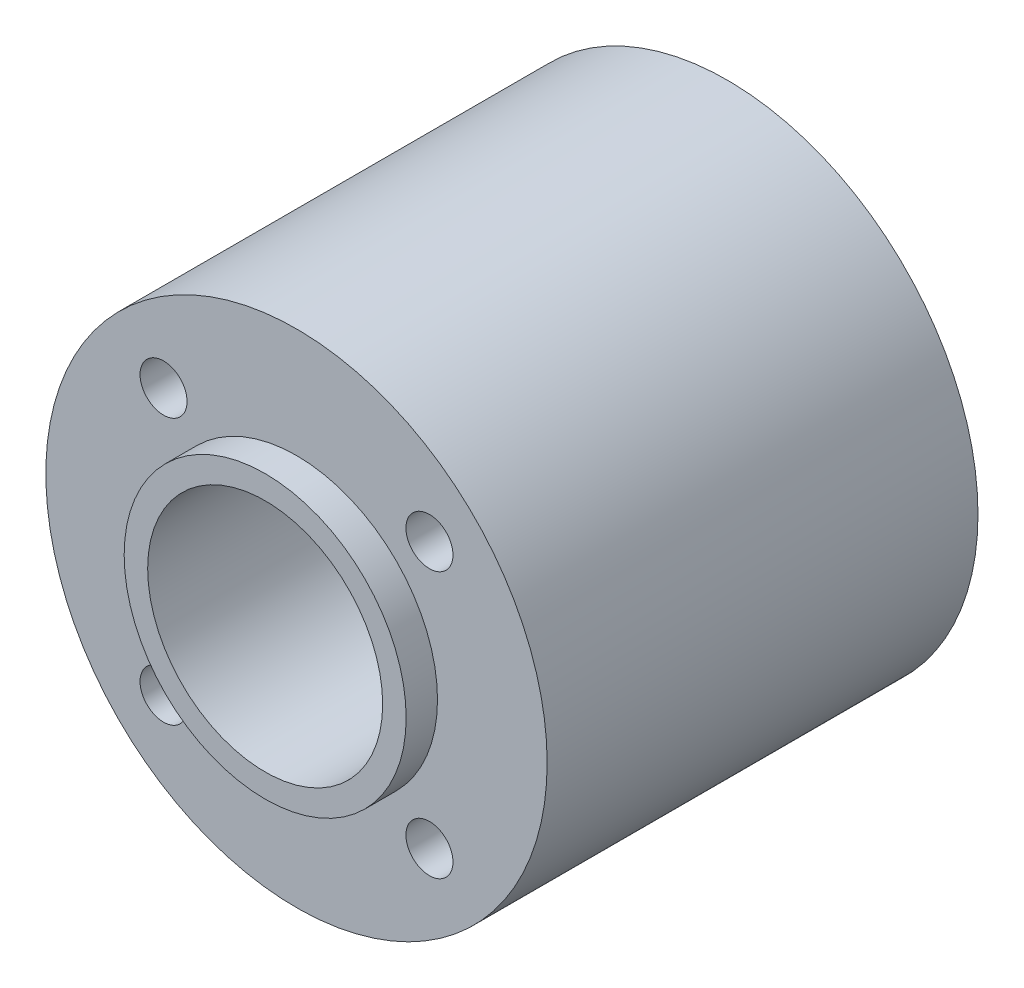
ISO-10303-21;
HEADER;
FILE_DESCRIPTION(('STEP AP214'),'2;1');
FILE_NAME('part.step','',(''),(''),'','','');
FILE_SCHEMA(('AUTOMOTIVE_DESIGN { 1 0 10303 214 1 1 1 1 }'));
ENDSEC;
DATA;
#1=APPLICATION_CONTEXT('core data for automotive mechanical design processes');
#2=APPLICATION_PROTOCOL_DEFINITION('international standard','automotive_design',2000,#1);
#3=PRODUCT_CONTEXT('',#1,'mechanical');
#4=PRODUCT('Part','Part','',(#3));
#5=PRODUCT_RELATED_PRODUCT_CATEGORY('part','',(#4));
#6=PRODUCT_DEFINITION_FORMATION('','',#4);
#7=PRODUCT_DEFINITION_CONTEXT('part definition',#1,'design');
#8=PRODUCT_DEFINITION('design','',#6,#7);
#9=PRODUCT_DEFINITION_SHAPE('','',#8);
#10=(LENGTH_UNIT() NAMED_UNIT(*) SI_UNIT(.MILLI.,.METRE.));
#11=(NAMED_UNIT(*) PLANE_ANGLE_UNIT() SI_UNIT($,.RADIAN.));
#12=(NAMED_UNIT(*) SI_UNIT($,.STERADIAN.) SOLID_ANGLE_UNIT());
#13=UNCERTAINTY_MEASURE_WITH_UNIT(LENGTH_MEASURE(1.E-05),#10,'distance_accuracy_value','');
#14=(GEOMETRIC_REPRESENTATION_CONTEXT(3) GLOBAL_UNCERTAINTY_ASSIGNED_CONTEXT((#13)) GLOBAL_UNIT_ASSIGNED_CONTEXT((#10,
#11,#12)) REPRESENTATION_CONTEXT('',''));
#15=CARTESIAN_POINT('',(0.,0.,0.));
#16=DIRECTION('',(0.,0.,1.));
#17=DIRECTION('',(1.,0.,0.));
#18=AXIS2_PLACEMENT_3D('',#15,#16,#17);
#19=CARTESIAN_POINT('',(0.,0.,27.5));
#20=DIRECTION('',(0.,0.,1.));
#21=DIRECTION('',(1.,0.,0.));
#22=AXIS2_PLACEMENT_3D('',#19,#20,#21);
#23=PLANE('',#22);
#24=CARTESIAN_POINT('',(8.48528137423855,-8.48528137423859,27.5));
#25=DIRECTION('',(0.,0.,1.));
#26=DIRECTION('',(1.,0.,0.));
#27=AXIS2_PLACEMENT_3D('',#24,#25,#26);
#28=CIRCLE('',#27,1.50000000000011);
#29=CARTESIAN_POINT('',(9.98528137423867,-8.48528137423859,27.5));
#30=VERTEX_POINT('',#29);
#31=EDGE_CURVE('E74',#30,#30,#28,.T.);
#32=ORIENTED_EDGE('',*,*,#31,.F.);
#33=EDGE_LOOP('',(#32));
#34=FACE_BOUND('',#33,.T.);
#35=CARTESIAN_POINT('',(-8.48528137423859,-8.48528137423855,27.5));
#36=DIRECTION('',(0.,0.,1.));
#37=DIRECTION('',(1.,0.,0.));
#38=AXIS2_PLACEMENT_3D('',#35,#36,#37);
#39=CIRCLE('',#38,1.50000000000008);
#40=CARTESIAN_POINT('',(-6.98528137423851,-8.48528137423855,27.5));
#41=VERTEX_POINT('',#40);
#42=EDGE_CURVE('E77',#41,#41,#39,.T.);
#43=ORIENTED_EDGE('',*,*,#42,.F.);
#44=EDGE_LOOP('',(#43));
#45=FACE_BOUND('',#44,.T.);
#46=CARTESIAN_POINT('',(-8.48528137423855,8.48528137423859,27.5));
#47=DIRECTION('',(0.,0.,1.));
#48=DIRECTION('',(1.,0.,0.));
#49=AXIS2_PLACEMENT_3D('',#46,#47,#48);
#50=CIRCLE('',#49,1.50000000000004);
#51=CARTESIAN_POINT('',(-6.98528137423852,8.48528137423859,27.5));
#52=VERTEX_POINT('',#51);
#53=EDGE_CURVE('E80',#52,#52,#50,.T.);
#54=ORIENTED_EDGE('',*,*,#53,.F.);
#55=EDGE_LOOP('',(#54));
#56=FACE_BOUND('',#55,.T.);
#57=CARTESIAN_POINT('',(8.48528137423859,8.48528137423855,27.5));
#58=DIRECTION('',(0.,0.,1.));
#59=DIRECTION('',(1.,0.,0.));
#60=AXIS2_PLACEMENT_3D('',#57,#58,#59);
#61=CIRCLE('',#60,1.5);
#62=CARTESIAN_POINT('',(9.98528137423859,8.48528137423855,27.5));
#63=VERTEX_POINT('',#62);
#64=EDGE_CURVE('E83',#63,#63,#61,.T.);
#65=ORIENTED_EDGE('',*,*,#64,.F.);
#66=EDGE_LOOP('',(#65));
#67=FACE_BOUND('',#66,.T.);
#68=CARTESIAN_POINT('',(0.,0.,27.5));
#69=DIRECTION('',(0.,0.,1.));
#70=DIRECTION('',(1.,0.,0.));
#71=AXIS2_PLACEMENT_3D('',#68,#69,#70);
#72=CIRCLE('',#71,16.);
#73=CARTESIAN_POINT('',(16.,0.,27.5));
#74=VERTEX_POINT('',#73);
#75=EDGE_CURVE('E11',#74,#74,#72,.T.);
#76=ORIENTED_EDGE('',*,*,#75,.T.);
#77=EDGE_LOOP('',(#76));
#78=FACE_BOUND('',#77,.T.);
#79=CARTESIAN_POINT('',(0.,0.,27.5));
#80=DIRECTION('',(0.,0.,1.));
#81=DIRECTION('',(1.,0.,0.));
#82=AXIS2_PLACEMENT_3D('',#79,#80,#81);
#83=CIRCLE('',#82,9.);
#84=CARTESIAN_POINT('',(9.,0.,27.5));
#85=VERTEX_POINT('',#84);
#86=EDGE_CURVE('E66',#85,#85,#83,.T.);
#87=ORIENTED_EDGE('',*,*,#86,.F.);
#88=EDGE_LOOP('',(#87));
#89=FACE_BOUND('',#88,.T.);
#90=ADVANCED_FACE('F44',(#34,#45,#56,#67,#78,#89),#23,.T.);
#91=CARTESIAN_POINT('',(0.,0.,27.5));
#92=DIRECTION('',(0.,0.,-1.));
#93=DIRECTION('',(-1.,0.,0.));
#94=AXIS2_PLACEMENT_3D('',#91,#92,#93);
#95=CYLINDRICAL_SURFACE('',#94,7.5);
#96=CARTESIAN_POINT('',(0.,0.,-2.));
#97=DIRECTION('',(0.,0.,1.));
#98=DIRECTION('',(1.,0.,0.));
#99=AXIS2_PLACEMENT_3D('',#96,#97,#98);
#100=CIRCLE('',#99,7.5);
#101=CARTESIAN_POINT('',(7.5,0.,-2.));
#102=VERTEX_POINT('',#101);
#103=EDGE_CURVE('E60',#102,#102,#100,.T.);
#104=ORIENTED_EDGE('',*,*,#103,.F.);
#105=EDGE_LOOP('',(#104));
#106=FACE_BOUND('',#105,.T.);
#107=CARTESIAN_POINT('',(0.,0.,29.5));
#108=DIRECTION('',(0.,0.,1.));
#109=DIRECTION('',(1.,0.,0.));
#110=AXIS2_PLACEMENT_3D('',#107,#108,#109);
#111=CIRCLE('',#110,7.5);
#112=CARTESIAN_POINT('',(7.5,0.,29.5));
#113=VERTEX_POINT('',#112);
#114=EDGE_CURVE('E69',#113,#113,#111,.T.);
#115=ORIENTED_EDGE('',*,*,#114,.T.);
#116=EDGE_LOOP('',(#115));
#117=FACE_BOUND('',#116,.T.);
#118=ADVANCED_FACE('F46',(#106,#117),#95,.F.);
#119=CARTESIAN_POINT('',(0.,0.,27.5));
#120=DIRECTION('',(0.,0.,-1.));
#121=DIRECTION('',(-1.,0.,0.));
#122=AXIS2_PLACEMENT_3D('',#119,#120,#121);
#123=CYLINDRICAL_SURFACE('',#122,16.);
#124=ORIENTED_EDGE('',*,*,#75,.F.);
#125=EDGE_LOOP('',(#124));
#126=FACE_BOUND('',#125,.T.);
#127=CARTESIAN_POINT('',(0.,0.,0.));
#128=DIRECTION('',(0.,0.,1.));
#129=DIRECTION('',(1.,0.,0.));
#130=AXIS2_PLACEMENT_3D('',#127,#128,#129);
#131=CIRCLE('',#130,16.);
#132=CARTESIAN_POINT('',(16.,0.,0.));
#133=VERTEX_POINT('',#132);
#134=EDGE_CURVE('E48',#133,#133,#131,.T.);
#135=ORIENTED_EDGE('',*,*,#134,.T.);
#136=EDGE_LOOP('',(#135));
#137=FACE_BOUND('',#136,.T.);
#138=ADVANCED_FACE('F105',(#126,#137),#123,.T.);
#139=CARTESIAN_POINT('',(0.,0.,0.));
#140=DIRECTION('',(0.,0.,1.));
#141=DIRECTION('',(1.,0.,0.));
#142=AXIS2_PLACEMENT_3D('',#139,#140,#141);
#143=PLANE('',#142);
#144=CARTESIAN_POINT('',(8.48528137423855,-8.48528137423859,0.));
#145=DIRECTION('',(0.,0.,-1.));
#146=DIRECTION('',(-1.,0.,0.));
#147=AXIS2_PLACEMENT_3D('',#144,#145,#146);
#148=CIRCLE('',#147,1.50000000000011);
#149=CARTESIAN_POINT('',(6.98528137423844,-8.48528137423859,0.));
#150=VERTEX_POINT('',#149);
#151=EDGE_CURVE('E90',#150,#150,#148,.T.);
#152=ORIENTED_EDGE('',*,*,#151,.F.);
#153=EDGE_LOOP('',(#152));
#154=FACE_BOUND('',#153,.T.);
#155=CARTESIAN_POINT('',(-8.48528137423859,-8.48528137423855,0.));
#156=DIRECTION('',(0.,0.,-1.));
#157=DIRECTION('',(-1.,0.,0.));
#158=AXIS2_PLACEMENT_3D('',#155,#156,#157);
#159=CIRCLE('',#158,1.50000000000008);
#160=CARTESIAN_POINT('',(-9.98528137423866,-8.48528137423855,0.));
#161=VERTEX_POINT('',#160);
#162=EDGE_CURVE('E93',#161,#161,#159,.T.);
#163=ORIENTED_EDGE('',*,*,#162,.F.);
#164=EDGE_LOOP('',(#163));
#165=FACE_BOUND('',#164,.T.);
#166=CARTESIAN_POINT('',(-8.48528137423855,8.48528137423859,0.));
#167=DIRECTION('',(0.,0.,-1.));
#168=DIRECTION('',(-1.,0.,0.));
#169=AXIS2_PLACEMENT_3D('',#166,#167,#168);
#170=CIRCLE('',#169,1.50000000000004);
#171=CARTESIAN_POINT('',(-9.98528137423859,8.48528137423859,0.));
#172=VERTEX_POINT('',#171);
#173=EDGE_CURVE('E89',#172,#172,#170,.T.);
#174=ORIENTED_EDGE('',*,*,#173,.F.);
#175=EDGE_LOOP('',(#174));
#176=FACE_BOUND('',#175,.T.);
#177=CARTESIAN_POINT('',(8.48528137423859,8.48528137423855,0.));
#178=DIRECTION('',(0.,0.,-1.));
#179=DIRECTION('',(-1.,0.,0.));
#180=AXIS2_PLACEMENT_3D('',#177,#178,#179);
#181=CIRCLE('',#180,1.5);
#182=CARTESIAN_POINT('',(6.98528137423859,8.48528137423855,0.));
#183=VERTEX_POINT('',#182);
#184=EDGE_CURVE('E86',#183,#183,#181,.T.);
#185=ORIENTED_EDGE('',*,*,#184,.F.);
#186=EDGE_LOOP('',(#185));
#187=FACE_BOUND('',#186,.T.);
#188=CARTESIAN_POINT('',(0.,0.,0.));
#189=DIRECTION('',(0.,0.,1.));
#190=DIRECTION('',(1.,0.,0.));
#191=AXIS2_PLACEMENT_3D('',#188,#189,#190);
#192=CIRCLE('',#191,9.);
#193=CARTESIAN_POINT('',(9.,0.,0.));
#194=VERTEX_POINT('',#193);
#195=EDGE_CURVE('E57',#194,#194,#192,.T.);
#196=ORIENTED_EDGE('',*,*,#195,.T.);
#197=EDGE_LOOP('',(#196));
#198=FACE_BOUND('',#197,.T.);
#199=ORIENTED_EDGE('',*,*,#134,.F.);
#200=EDGE_LOOP('',(#199));
#201=FACE_BOUND('',#200,.T.);
#202=ADVANCED_FACE('F101',(#154,#165,#176,#187,#198,#201),#143,.F.);
#203=CARTESIAN_POINT('',(0.,0.,-2.));
#204=DIRECTION('',(0.,0.,1.));
#205=DIRECTION('',(1.,0.,0.));
#206=AXIS2_PLACEMENT_3D('',#203,#204,#205);
#207=CYLINDRICAL_SURFACE('',#206,9.);
#208=CARTESIAN_POINT('',(0.,0.,-2.));
#209=DIRECTION('',(0.,0.,1.));
#210=DIRECTION('',(1.,0.,0.));
#211=AXIS2_PLACEMENT_3D('',#208,#209,#210);
#212=CIRCLE('',#211,9.);
#213=CARTESIAN_POINT('',(9.,0.,-2.));
#214=VERTEX_POINT('',#213);
#215=EDGE_CURVE('E55',#214,#214,#212,.T.);
#216=ORIENTED_EDGE('',*,*,#215,.T.);
#217=EDGE_LOOP('',(#216));
#218=FACE_BOUND('',#217,.T.);
#219=ORIENTED_EDGE('',*,*,#195,.F.);
#220=EDGE_LOOP('',(#219));
#221=FACE_BOUND('',#220,.T.);
#222=ADVANCED_FACE('F104',(#218,#221),#207,.T.);
#223=CARTESIAN_POINT('',(0.,0.,-2.));
#224=DIRECTION('',(0.,0.,1.));
#225=DIRECTION('',(1.,0.,0.));
#226=AXIS2_PLACEMENT_3D('',#223,#224,#225);
#227=PLANE('',#226);
#228=ORIENTED_EDGE('',*,*,#103,.T.);
#229=EDGE_LOOP('',(#228));
#230=FACE_BOUND('',#229,.T.);
#231=ORIENTED_EDGE('',*,*,#215,.F.);
#232=EDGE_LOOP('',(#231));
#233=FACE_BOUND('',#232,.T.);
#234=ADVANCED_FACE('F130',(#230,#233),#227,.F.);
#235=CARTESIAN_POINT('',(0.,0.,29.5));
#236=DIRECTION('',(0.,0.,1.));
#237=DIRECTION('',(1.,0.,0.));
#238=AXIS2_PLACEMENT_3D('',#235,#236,#237);
#239=PLANE('',#238);
#240=CARTESIAN_POINT('',(0.,0.,29.5));
#241=DIRECTION('',(0.,0.,1.));
#242=DIRECTION('',(1.,0.,0.));
#243=AXIS2_PLACEMENT_3D('',#240,#241,#242);
#244=CIRCLE('',#243,9.);
#245=CARTESIAN_POINT('',(9.,0.,29.5));
#246=VERTEX_POINT('',#245);
#247=EDGE_CURVE('E61',#246,#246,#244,.T.);
#248=ORIENTED_EDGE('',*,*,#247,.T.);
#249=EDGE_LOOP('',(#248));
#250=FACE_BOUND('',#249,.T.);
#251=ORIENTED_EDGE('',*,*,#114,.F.);
#252=EDGE_LOOP('',(#251));
#253=FACE_BOUND('',#252,.T.);
#254=ADVANCED_FACE('F134',(#250,#253),#239,.T.);
#255=CARTESIAN_POINT('',(0.,0.,29.5));
#256=DIRECTION('',(0.,0.,-1.));
#257=DIRECTION('',(-1.,0.,0.));
#258=AXIS2_PLACEMENT_3D('',#255,#256,#257);
#259=CYLINDRICAL_SURFACE('',#258,9.);
#260=ORIENTED_EDGE('',*,*,#247,.F.);
#261=EDGE_LOOP('',(#260));
#262=FACE_BOUND('',#261,.T.);
#263=ORIENTED_EDGE('',*,*,#86,.T.);
#264=EDGE_LOOP('',(#263));
#265=FACE_BOUND('',#264,.T.);
#266=ADVANCED_FACE('F136',(#262,#265),#259,.T.);
#267=CARTESIAN_POINT('',(8.48528137423859,8.48528137423855,29.5));
#268=DIRECTION('',(0.,0.,-1.));
#269=DIRECTION('',(-1.,0.,0.));
#270=AXIS2_PLACEMENT_3D('',#267,#268,#269);
#271=CYLINDRICAL_SURFACE('',#270,1.5);
#272=ORIENTED_EDGE('',*,*,#64,.T.);
#273=EDGE_LOOP('',(#272));
#274=FACE_BOUND('',#273,.T.);
#275=ORIENTED_EDGE('',*,*,#184,.T.);
#276=EDGE_LOOP('',(#275));
#277=FACE_BOUND('',#276,.T.);
#278=ADVANCED_FACE('F139',(#274,#277),#271,.F.);
#279=CARTESIAN_POINT('',(-8.48528137423855,8.48528137423859,29.5));
#280=DIRECTION('',(0.,0.,-1.));
#281=DIRECTION('',(-1.,0.,0.));
#282=AXIS2_PLACEMENT_3D('',#279,#280,#281);
#283=CYLINDRICAL_SURFACE('',#282,1.50000000000004);
#284=ORIENTED_EDGE('',*,*,#53,.T.);
#285=EDGE_LOOP('',(#284));
#286=FACE_BOUND('',#285,.T.);
#287=ORIENTED_EDGE('',*,*,#173,.T.);
#288=EDGE_LOOP('',(#287));
#289=FACE_BOUND('',#288,.T.);
#290=ADVANCED_FACE('F99',(#286,#289),#283,.F.);
#291=CARTESIAN_POINT('',(-8.48528137423859,-8.48528137423855,29.5));
#292=DIRECTION('',(0.,0.,-1.));
#293=DIRECTION('',(-1.,0.,0.));
#294=AXIS2_PLACEMENT_3D('',#291,#292,#293);
#295=CYLINDRICAL_SURFACE('',#294,1.50000000000008);
#296=ORIENTED_EDGE('',*,*,#42,.T.);
#297=EDGE_LOOP('',(#296));
#298=FACE_BOUND('',#297,.T.);
#299=ORIENTED_EDGE('',*,*,#162,.T.);
#300=EDGE_LOOP('',(#299));
#301=FACE_BOUND('',#300,.T.);
#302=ADVANCED_FACE('F150',(#298,#301),#295,.F.);
#303=CARTESIAN_POINT('',(8.48528137423855,-8.48528137423859,29.5));
#304=DIRECTION('',(0.,0.,-1.));
#305=DIRECTION('',(-1.,0.,0.));
#306=AXIS2_PLACEMENT_3D('',#303,#304,#305);
#307=CYLINDRICAL_SURFACE('',#306,1.50000000000011);
#308=ORIENTED_EDGE('',*,*,#31,.T.);
#309=EDGE_LOOP('',(#308));
#310=FACE_BOUND('',#309,.T.);
#311=ORIENTED_EDGE('',*,*,#151,.T.);
#312=EDGE_LOOP('',(#311));
#313=FACE_BOUND('',#312,.T.);
#314=ADVANCED_FACE('F147',(#310,#313),#307,.F.);
#315=CLOSED_SHELL('',(#90,#118,#138,#202,#222,#234,#254,#266,#278,#290,#302,#314));
#316=MANIFOLD_SOLID_BREP('B2',#315);
#317=ADVANCED_BREP_SHAPE_REPRESENTATION('',(#18,#316),#14);
#318=SHAPE_DEFINITION_REPRESENTATION(#9,#317);
ENDSEC;
END-ISO-10303-21;
